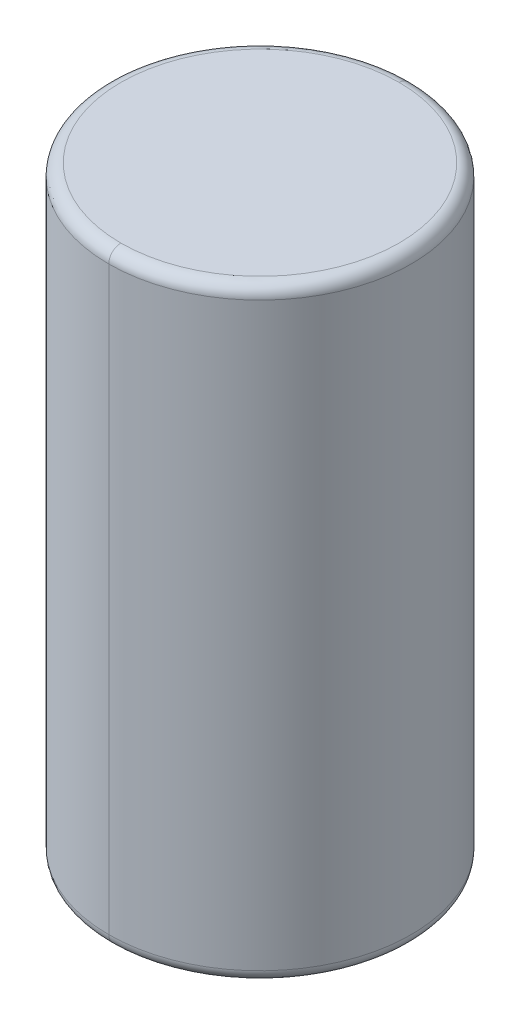
ISO-10303-21;
HEADER;
FILE_DESCRIPTION(('STEP AP214'),'2;1');
FILE_NAME('part.step','',(''),(''),'','','');
FILE_SCHEMA(('AUTOMOTIVE_DESIGN { 1 0 10303 214 1 1 1 1 }'));
ENDSEC;
DATA;
#1=APPLICATION_CONTEXT('core data for automotive mechanical design processes');
#2=APPLICATION_PROTOCOL_DEFINITION('international standard','automotive_design',2000,#1);
#3=PRODUCT_CONTEXT('',#1,'mechanical');
#4=PRODUCT('Part','Part','',(#3));
#5=PRODUCT_RELATED_PRODUCT_CATEGORY('part','',(#4));
#6=PRODUCT_DEFINITION_FORMATION('','',#4);
#7=PRODUCT_DEFINITION_CONTEXT('part definition',#1,'design');
#8=PRODUCT_DEFINITION('design','',#6,#7);
#9=PRODUCT_DEFINITION_SHAPE('','',#8);
#10=(LENGTH_UNIT() NAMED_UNIT(*) SI_UNIT(.MILLI.,.METRE.));
#11=(NAMED_UNIT(*) PLANE_ANGLE_UNIT() SI_UNIT($,.RADIAN.));
#12=(NAMED_UNIT(*) SI_UNIT($,.STERADIAN.) SOLID_ANGLE_UNIT());
#13=UNCERTAINTY_MEASURE_WITH_UNIT(LENGTH_MEASURE(1.E-05),#10,'distance_accuracy_value','');
#14=(GEOMETRIC_REPRESENTATION_CONTEXT(3) GLOBAL_UNCERTAINTY_ASSIGNED_CONTEXT((#13)) GLOBAL_UNIT_ASSIGNED_CONTEXT((#10,
#11,#12)) REPRESENTATION_CONTEXT('',''));
#15=CARTESIAN_POINT('',(0.,0.,0.));
#16=DIRECTION('',(0.,0.,1.));
#17=DIRECTION('',(1.,0.,0.));
#18=AXIS2_PLACEMENT_3D('',#15,#16,#17);
#19=CARTESIAN_POINT('',(0.,6.096,0.));
#20=DIRECTION('',(0.,1.,0.));
#21=DIRECTION('',(0.,0.,1.));
#22=AXIS2_PLACEMENT_3D('',#19,#20,#21);
#23=TOROIDAL_SURFACE('',#22,2.921,0.254);
#24=CARTESIAN_POINT('',(0.,6.096,-2.921));
#25=DIRECTION('',(1.,0.,0.));
#26=DIRECTION('',(0.,0.,-1.));
#27=AXIS2_PLACEMENT_3D('',#24,#25,#26);
#28=CIRCLE('',#27,0.254);
#29=CARTESIAN_POINT('',(0.,6.096,-3.175));
#30=VERTEX_POINT('',#29);
#31=CARTESIAN_POINT('',(0.,6.35,-2.921));
#32=VERTEX_POINT('',#31);
#33=EDGE_CURVE('E112',#30,#32,#28,.T.);
#34=ORIENTED_EDGE('',*,*,#33,.F.);
#35=CARTESIAN_POINT('',(0.,6.096,0.));
#36=DIRECTION('',(0.,-1.,0.));
#37=DIRECTION('',(0.,0.,1.));
#38=AXIS2_PLACEMENT_3D('',#35,#36,#37);
#39=CIRCLE('',#38,3.175);
#40=CARTESIAN_POINT('',(0.,6.096,3.175));
#41=VERTEX_POINT('',#40);
#42=EDGE_CURVE('E60',#41,#30,#39,.T.);
#43=ORIENTED_EDGE('',*,*,#42,.F.);
#44=CARTESIAN_POINT('',(0.,6.096,2.921));
#45=DIRECTION('',(-1.,0.,0.));
#46=DIRECTION('',(0.,0.,1.));
#47=AXIS2_PLACEMENT_3D('',#44,#45,#46);
#48=CIRCLE('',#47,0.254);
#49=CARTESIAN_POINT('',(0.,6.35,2.921));
#50=VERTEX_POINT('',#49);
#51=EDGE_CURVE('E99',#41,#50,#48,.T.);
#52=ORIENTED_EDGE('',*,*,#51,.T.);
#53=CARTESIAN_POINT('',(0.,6.35,0.));
#54=DIRECTION('',(0.,1.,0.));
#55=DIRECTION('',(0.,0.,1.));
#56=AXIS2_PLACEMENT_3D('',#53,#54,#55);
#57=CIRCLE('',#56,2.921);
#58=EDGE_CURVE('E27',#32,#50,#57,.T.);
#59=ORIENTED_EDGE('',*,*,#58,.F.);
#60=EDGE_LOOP('',(#34,#43,#52,#59));
#61=FACE_BOUND('',#60,.T.);
#62=ADVANCED_FACE('F16',(#61),#23,.T.);
#63=CARTESIAN_POINT('',(0.,-6.096,0.));
#64=DIRECTION('',(0.,1.,0.));
#65=DIRECTION('',(0.,0.,1.));
#66=AXIS2_PLACEMENT_3D('',#63,#64,#65);
#67=TOROIDAL_SURFACE('',#66,2.921,0.254);
#68=CARTESIAN_POINT('',(0.,-6.096,-2.921));
#69=DIRECTION('',(1.,0.,0.));
#70=DIRECTION('',(0.,0.,-1.));
#71=AXIS2_PLACEMENT_3D('',#68,#69,#70);
#72=CIRCLE('',#71,0.254);
#73=CARTESIAN_POINT('',(0.,-6.35,-2.921));
#74=VERTEX_POINT('',#73);
#75=CARTESIAN_POINT('',(0.,-6.096,-3.175));
#76=VERTEX_POINT('',#75);
#77=EDGE_CURVE('E89',#74,#76,#72,.T.);
#78=ORIENTED_EDGE('',*,*,#77,.F.);
#79=CARTESIAN_POINT('',(0.,-6.35,0.));
#80=DIRECTION('',(0.,-1.,0.));
#81=DIRECTION('',(0.,0.,1.));
#82=AXIS2_PLACEMENT_3D('',#79,#80,#81);
#83=CIRCLE('',#82,2.921);
#84=CARTESIAN_POINT('',(0.,-6.35,2.921));
#85=VERTEX_POINT('',#84);
#86=EDGE_CURVE('E11',#85,#74,#83,.T.);
#87=ORIENTED_EDGE('',*,*,#86,.F.);
#88=CARTESIAN_POINT('',(0.,-6.096,2.921));
#89=DIRECTION('',(-1.,0.,0.));
#90=DIRECTION('',(0.,0.,1.));
#91=AXIS2_PLACEMENT_3D('',#88,#89,#90);
#92=CIRCLE('',#91,0.254);
#93=CARTESIAN_POINT('',(0.,-6.096,3.175));
#94=VERTEX_POINT('',#93);
#95=EDGE_CURVE('E97',#85,#94,#92,.T.);
#96=ORIENTED_EDGE('',*,*,#95,.T.);
#97=CARTESIAN_POINT('',(0.,-6.096,0.));
#98=DIRECTION('',(0.,1.,0.));
#99=DIRECTION('',(0.,0.,1.));
#100=AXIS2_PLACEMENT_3D('',#97,#98,#99);
#101=CIRCLE('',#100,3.175);
#102=EDGE_CURVE('E42',#76,#94,#101,.T.);
#103=ORIENTED_EDGE('',*,*,#102,.F.);
#104=EDGE_LOOP('',(#78,#87,#96,#103));
#105=FACE_BOUND('',#104,.T.);
#106=ADVANCED_FACE('F90',(#105),#67,.T.);
#107=CARTESIAN_POINT('',(0.,-6.35,0.));
#108=DIRECTION('',(0.,1.,0.));
#109=DIRECTION('',(1.,0.,0.));
#110=AXIS2_PLACEMENT_3D('',#107,#108,#109);
#111=PLANE('',#110);
#112=ORIENTED_EDGE('',*,*,#86,.T.);
#113=CARTESIAN_POINT('',(0.,-6.35,0.));
#114=DIRECTION('',(0.,-1.,0.));
#115=DIRECTION('',(0.,0.,1.));
#116=AXIS2_PLACEMENT_3D('',#113,#114,#115);
#117=CIRCLE('',#116,2.921);
#118=EDGE_CURVE('E84',#74,#85,#117,.T.);
#119=ORIENTED_EDGE('',*,*,#118,.T.);
#120=EDGE_LOOP('',(#112,#119));
#121=FACE_BOUND('',#120,.T.);
#122=ADVANCED_FACE('F82',(#121),#111,.F.);
#123=CARTESIAN_POINT('',(0.,6.35,0.));
#124=DIRECTION('',(0.,1.,0.));
#125=DIRECTION('',(1.,0.,0.));
#126=AXIS2_PLACEMENT_3D('',#123,#124,#125);
#127=PLANE('',#126);
#128=CARTESIAN_POINT('',(0.,6.35,0.));
#129=DIRECTION('',(0.,1.,0.));
#130=DIRECTION('',(0.,0.,1.));
#131=AXIS2_PLACEMENT_3D('',#128,#129,#130);
#132=CIRCLE('',#131,2.921);
#133=EDGE_CURVE('E106',#50,#32,#132,.T.);
#134=ORIENTED_EDGE('',*,*,#133,.T.);
#135=ORIENTED_EDGE('',*,*,#58,.T.);
#136=EDGE_LOOP('',(#134,#135));
#137=FACE_BOUND('',#136,.T.);
#138=ADVANCED_FACE('F18',(#137),#127,.T.);
#139=CARTESIAN_POINT('',(0.,6.35,0.));
#140=DIRECTION('',(0.,-1.,0.));
#141=DIRECTION('',(0.,0.,-1.));
#142=AXIS2_PLACEMENT_3D('',#139,#140,#141);
#143=CYLINDRICAL_SURFACE('',#142,3.175);
#144=DIRECTION('',(0.,-1.,0.));
#145=VECTOR('',#144,1.);
#146=CARTESIAN_POINT('',(0.,6.35,3.175));
#147=LINE('',#146,#145);
#148=EDGE_CURVE('E124',#41,#94,#147,.T.);
#149=ORIENTED_EDGE('',*,*,#148,.F.);
#150=ORIENTED_EDGE('',*,*,#42,.T.);
#151=DIRECTION('',(0.,-1.,0.));
#152=VECTOR('',#151,1.);
#153=CARTESIAN_POINT('',(0.,6.35,-3.175));
#154=LINE('',#153,#152);
#155=EDGE_CURVE('E20',#30,#76,#154,.T.);
#156=ORIENTED_EDGE('',*,*,#155,.T.);
#157=ORIENTED_EDGE('',*,*,#102,.T.);
#158=EDGE_LOOP('',(#149,#150,#156,#157));
#159=FACE_BOUND('',#158,.T.);
#160=ADVANCED_FACE('F200',(#159),#143,.T.);
#161=CARTESIAN_POINT('',(0.,6.35,0.));
#162=DIRECTION('',(0.,-1.,0.));
#163=DIRECTION('',(0.,0.,-1.));
#164=AXIS2_PLACEMENT_3D('',#161,#162,#163);
#165=CYLINDRICAL_SURFACE('',#164,3.175);
#166=CARTESIAN_POINT('',(0.,6.096,0.));
#167=DIRECTION('',(0.,-1.,0.));
#168=DIRECTION('',(0.,0.,1.));
#169=AXIS2_PLACEMENT_3D('',#166,#167,#168);
#170=CIRCLE('',#169,3.175);
#171=EDGE_CURVE('E116',#30,#41,#170,.T.);
#172=ORIENTED_EDGE('',*,*,#171,.T.);
#173=ORIENTED_EDGE('',*,*,#148,.T.);
#174=CARTESIAN_POINT('',(0.,-6.096,0.));
#175=DIRECTION('',(0.,1.,0.));
#176=DIRECTION('',(0.,0.,1.));
#177=AXIS2_PLACEMENT_3D('',#174,#175,#176);
#178=CIRCLE('',#177,3.175);
#179=EDGE_CURVE('E94',#94,#76,#178,.T.);
#180=ORIENTED_EDGE('',*,*,#179,.T.);
#181=ORIENTED_EDGE('',*,*,#155,.F.);
#182=EDGE_LOOP('',(#172,#173,#180,#181));
#183=FACE_BOUND('',#182,.T.);
#184=ADVANCED_FACE('F138',(#183),#165,.T.);
#185=CARTESIAN_POINT('',(0.,-6.096,0.));
#186=DIRECTION('',(0.,1.,0.));
#187=DIRECTION('',(0.,0.,1.));
#188=AXIS2_PLACEMENT_3D('',#185,#186,#187);
#189=TOROIDAL_SURFACE('',#188,2.921,0.254);
#190=ORIENTED_EDGE('',*,*,#118,.F.);
#191=ORIENTED_EDGE('',*,*,#77,.T.);
#192=ORIENTED_EDGE('',*,*,#179,.F.);
#193=ORIENTED_EDGE('',*,*,#95,.F.);
#194=EDGE_LOOP('',(#190,#191,#192,#193));
#195=FACE_BOUND('',#194,.T.);
#196=ADVANCED_FACE('F96',(#195),#189,.T.);
#197=CARTESIAN_POINT('',(0.,6.096,0.));
#198=DIRECTION('',(0.,1.,0.));
#199=DIRECTION('',(0.,0.,1.));
#200=AXIS2_PLACEMENT_3D('',#197,#198,#199);
#201=TOROIDAL_SURFACE('',#200,2.921,0.254);
#202=ORIENTED_EDGE('',*,*,#171,.F.);
#203=ORIENTED_EDGE('',*,*,#33,.T.);
#204=ORIENTED_EDGE('',*,*,#133,.F.);
#205=ORIENTED_EDGE('',*,*,#51,.F.);
#206=EDGE_LOOP('',(#202,#203,#204,#205));
#207=FACE_BOUND('',#206,.T.);
#208=ADVANCED_FACE('F141',(#207),#201,.T.);
#209=CLOSED_SHELL('',(#62,#106,#122,#138,#160,#184,#196,#208));
#210=MANIFOLD_SOLID_BREP('B1',#209);
#211=ADVANCED_BREP_SHAPE_REPRESENTATION('',(#18,#210),#14);
#212=SHAPE_DEFINITION_REPRESENTATION(#9,#211);
ENDSEC;
END-ISO-10303-21;
